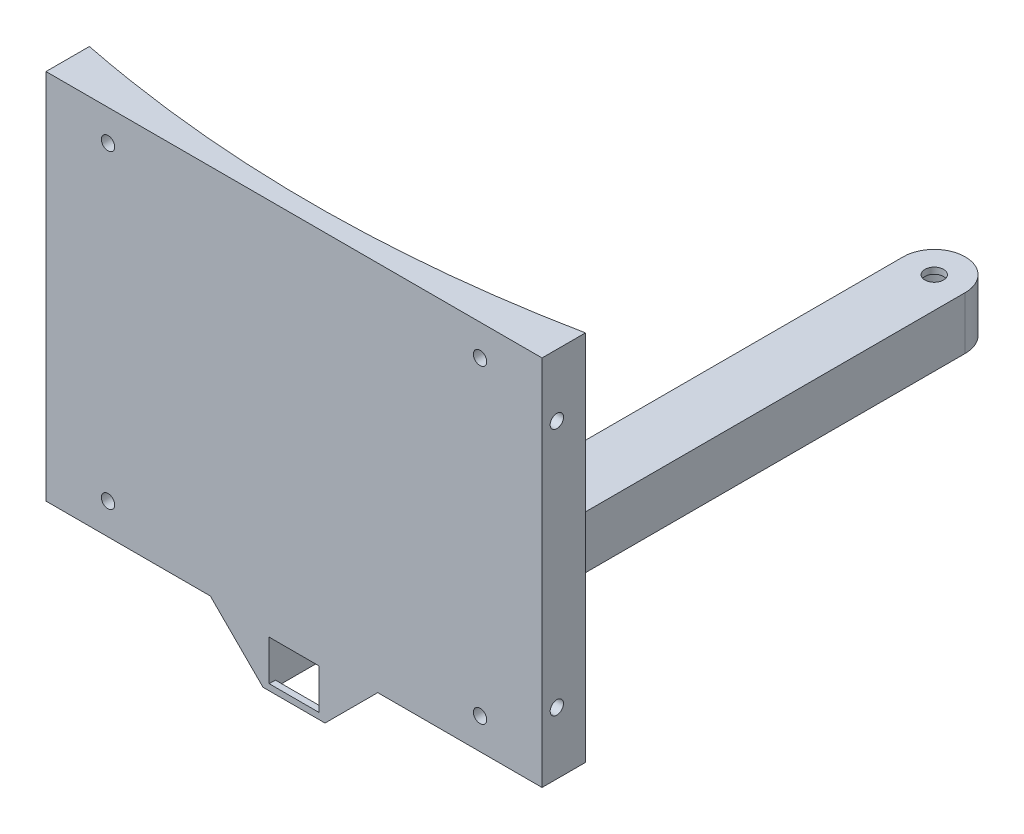
ISO-10303-21;
HEADER;
FILE_DESCRIPTION(('STEP AP214'),'2;1');
FILE_NAME('part.step','',(''),(''),'','','');
FILE_SCHEMA(('AUTOMOTIVE_DESIGN { 1 0 10303 214 1 1 1 1 }'));
ENDSEC;
DATA;
#1=APPLICATION_CONTEXT('core data for automotive mechanical design processes');
#2=APPLICATION_PROTOCOL_DEFINITION('international standard','automotive_design',2000,#1);
#3=PRODUCT_CONTEXT('',#1,'mechanical');
#4=PRODUCT('Part','Part','',(#3));
#5=PRODUCT_RELATED_PRODUCT_CATEGORY('part','',(#4));
#6=PRODUCT_DEFINITION_FORMATION('','',#4);
#7=PRODUCT_DEFINITION_CONTEXT('part definition',#1,'design');
#8=PRODUCT_DEFINITION('design','',#6,#7);
#9=PRODUCT_DEFINITION_SHAPE('','',#8);
#10=(LENGTH_UNIT() NAMED_UNIT(*) SI_UNIT(.MILLI.,.METRE.));
#11=(NAMED_UNIT(*) PLANE_ANGLE_UNIT() SI_UNIT($,.RADIAN.));
#12=(NAMED_UNIT(*) SI_UNIT($,.STERADIAN.) SOLID_ANGLE_UNIT());
#13=UNCERTAINTY_MEASURE_WITH_UNIT(LENGTH_MEASURE(1.E-05),#10,'distance_accuracy_value','');
#14=(GEOMETRIC_REPRESENTATION_CONTEXT(3) GLOBAL_UNCERTAINTY_ASSIGNED_CONTEXT((#13)) GLOBAL_UNIT_ASSIGNED_CONTEXT((#10,
#11,#12)) REPRESENTATION_CONTEXT('',''));
#15=CARTESIAN_POINT('',(0.,0.,0.));
#16=DIRECTION('',(0.,0.,1.));
#17=DIRECTION('',(1.,0.,0.));
#18=AXIS2_PLACEMENT_3D('',#15,#16,#17);
#19=CARTESIAN_POINT('',(0.,0.,200.499999999989));
#20=DIRECTION('',(0.,-1.,0.));
#21=DIRECTION('',(0.,0.,-1.));
#22=AXIS2_PLACEMENT_3D('',#19,#20,#21);
#23=PLANE('',#22);
#24=CARTESIAN_POINT('',(225.245130619814,0.,137.154537768553));
#25=CARTESIAN_POINT('',(222.90817603296,0.,138.469074723659));
#26=CARTESIAN_POINT('',(218.204067638298,0.,141.073902870023));
#27=CARTESIAN_POINT('',(208.827276173062,0.,146.100944940152));
#28=CARTESIAN_POINT('',(197.0951136339,0.,152.081763048426));
#29=CARTESIAN_POINT('',(183.020628450953,0.,158.761564513527));
#30=CARTESIAN_POINT('',(164.252323786063,0.,167.009400213228));
#31=CARTESIAN_POINT('',(140.791197461162,0.,176.082259845337));
#32=CARTESIAN_POINT('',(112.635650998168,0.,184.990896120193));
#33=CARTESIAN_POINT('',(84.4784352769108,0.,191.920233494286));
#34=CARTESIAN_POINT('',(46.9335816501035,0.,198.519950199365));
#35=CARTESIAN_POINT('',(-3.53883589099269E-13,0.,201.820033200405));
#36=CARTESIAN_POINT('',(-46.9335816501066,0.,198.519950199364));
#37=CARTESIAN_POINT('',(-84.4784352769144,0.,191.920233494286));
#38=CARTESIAN_POINT('',(-112.635650998168,0.,184.990896120192));
#39=CARTESIAN_POINT('',(-140.791197461168,0.,176.082259845335));
#40=CARTESIAN_POINT('',(-164.252323786066,0.,167.009400213228));
#41=CARTESIAN_POINT('',(-183.020628450954,0.,158.761564513527));
#42=CARTESIAN_POINT('',(-197.095113633908,0.,152.081763048424));
#43=CARTESIAN_POINT('',(-208.827276173067,0.,146.100944940152));
#44=CARTESIAN_POINT('',(-218.204067638301,0.,141.073902870022));
#45=CARTESIAN_POINT('',(-222.908176032963,0.,138.469074723657));
#46=CARTESIAN_POINT('',(-225.245130619819,0.,137.154537768551));
#47=B_SPLINE_CURVE_WITH_KNOTS('',3,(#24,#25,#26,#27,#28,#29,#30,#31,#32,#33,#34,#35,#36,#37,#38,
#39,#40,#41,#42,#43,#44,#45,#46),.UNSPECIFIED.,.F.,.F.,(4,1,1,1,1,1,1,1,1,1,1,1,1,1,1,1,1,1,1,1,
4),(0.496022524355826,0.496146820469706,0.496271116583587,0.496519708811347,0.496768301039108,
0.497016893266869,0.497514077722391,0.498011262177913,0.498508446633435,0.499005631088956,0.5,
0.500994368911044,0.501491553366565,0.501988737822087,0.502485922277609,0.502983106733131,
0.503231698960892,0.503480291188652,0.503728883416413,0.503853179530294,0.503977475644174),.UNSPECIFIED.);
#48=CARTESIAN_POINT('',(-26.9999999999983,0.,199.589880850301));
#49=VERTEX_POINT('',#48);
#50=CARTESIAN_POINT('',(-80.0000000000013,0.,192.509889922573));
#51=VERTEX_POINT('',#50);
#52=EDGE_CURVE('E254',#49,#51,#47,.T.);
#53=ORIENTED_EDGE('',*,*,#52,.F.);
#54=DIRECTION('',(0.,0.,1.));
#55=VECTOR('',#54,1.);
#56=CARTESIAN_POINT('',(-26.9999999999999,0.,200.499999999989));
#57=LINE('',#56,#55);
#58=CARTESIAN_POINT('',(-26.9999999999999,0.,206.499999999989));
#59=VERTEX_POINT('',#58);
#60=EDGE_CURVE('E353',#49,#59,#57,.T.);
#61=ORIENTED_EDGE('',*,*,#60,.T.);
#62=DIRECTION('',(1.,0.,0.));
#63=VECTOR('',#62,1.);
#64=CARTESIAN_POINT('',(-80.,0.,206.499999999989));
#65=LINE('',#64,#63);
#66=CARTESIAN_POINT('',(-80.,0.,206.499999999989));
#67=VERTEX_POINT('',#66);
#68=EDGE_CURVE('E345',#67,#59,#65,.T.);
#69=ORIENTED_EDGE('',*,*,#68,.F.);
#70=DIRECTION('',(0.,0.,1.));
#71=VECTOR('',#70,1.);
#72=CARTESIAN_POINT('',(-80.0000000000013,0.,192.509889922573));
#73=LINE('',#72,#71);
#74=EDGE_CURVE('E346',#51,#67,#73,.T.);
#75=ORIENTED_EDGE('',*,*,#74,.F.);
#76=EDGE_LOOP('',(#53,#61,#69,#75));
#77=FACE_BOUND('',#76,.T.);
#78=ADVANCED_FACE('F44',(#77),#23,.T.);
#79=CARTESIAN_POINT('',(225.245130619814,120.,137.154537768553));
#80=CARTESIAN_POINT('',(222.90817603296,120.,138.469074723659));
#81=CARTESIAN_POINT('',(218.204067638298,120.,141.073902870023));
#82=CARTESIAN_POINT('',(208.827276173062,120.,146.100944940152));
#83=CARTESIAN_POINT('',(197.0951136339,120.,152.081763048426));
#84=CARTESIAN_POINT('',(183.020628450953,120.,158.761564513527));
#85=CARTESIAN_POINT('',(164.252323786063,120.,167.009400213228));
#86=CARTESIAN_POINT('',(140.791197461162,120.,176.082259845337));
#87=CARTESIAN_POINT('',(112.635650998168,120.,184.990896120193));
#88=CARTESIAN_POINT('',(84.4784352769108,120.,191.920233494286));
#89=CARTESIAN_POINT('',(46.9335816501035,120.,198.519950199365));
#90=CARTESIAN_POINT('',(-3.53883589099269E-13,120.,201.820033200405));
#91=CARTESIAN_POINT('',(-46.9335816501066,120.,198.519950199364));
#92=CARTESIAN_POINT('',(-84.4784352769144,120.,191.920233494286));
#93=CARTESIAN_POINT('',(-112.635650998168,120.,184.990896120192));
#94=CARTESIAN_POINT('',(-140.791197461168,120.,176.082259845335));
#95=CARTESIAN_POINT('',(-164.252323786066,120.,167.009400213228));
#96=CARTESIAN_POINT('',(-183.020628450954,120.,158.761564513527));
#97=CARTESIAN_POINT('',(-197.095113633908,120.,152.081763048424));
#98=CARTESIAN_POINT('',(-208.827276173067,120.,146.100944940152));
#99=CARTESIAN_POINT('',(-218.204067638301,120.,141.073902870022));
#100=CARTESIAN_POINT('',(-222.908176032963,120.,138.469074723657));
#101=CARTESIAN_POINT('',(-225.245130619819,120.,137.154537768551));
#102=B_SPLINE_CURVE_WITH_KNOTS('',3,(#79,#80,#81,#82,#83,#84,#85,#86,#87,#88,#89,#90,#91,#92,
#93,#94,#95,#96,#97,#98,#99,#100,#101),.UNSPECIFIED.,.F.,.F.,(4,1,1,1,1,1,1,1,1,1,1,1,1,1,1,1,1,
1,1,1,4),(0.496022524355826,0.496146820469706,0.496271116583587,0.496519708811347,
0.496768301039108,0.497016893266869,0.497514077722391,0.498011262177913,0.498508446633435,
0.499005631088956,0.5,0.500994368911044,0.501491553366565,0.501988737822087,0.502485922277609,
0.502983106733131,0.503231698960892,0.503480291188652,0.503728883416413,0.503853179530294,
0.503977475644174),.UNSPECIFIED.);
#103=DIRECTION('',(0.,-1.,0.));
#104=VECTOR('',#103,1.);
#105=SURFACE_OF_LINEAR_EXTRUSION('',#102,#104);
#106=CARTESIAN_POINT('',(23.7702157531355,0.,199.794596875959));
#107=VERTEX_POINT('',#106);
#108=CARTESIAN_POINT('',(-23.7702157531355,0.,199.794596875959));
#109=VERTEX_POINT('',#108);
#110=EDGE_CURVE('E585',#107,#109,#47,.T.);
#111=ORIENTED_EDGE('',*,*,#110,.T.);
#112=DIRECTION('',(0.,-1.,0.));
#113=VECTOR('',#112,1.);
#114=CARTESIAN_POINT('',(-23.7702157531355,0.,199.794596875959));
#115=LINE('',#114,#113);
#116=CARTESIAN_POINT('',(-23.7702157531349,-3.22978424686177,199.794596875959));
#117=VERTEX_POINT('',#116);
#118=EDGE_CURVE('E372',#109,#117,#115,.T.);
#119=ORIENTED_EDGE('',*,*,#118,.T.);
#120=CARTESIAN_POINT('',(-10.,-17.0000000000001,200.375154287834));
#121=CARTESIAN_POINT('',(-12.8347207037561,-14.1652792962442,200.304344386998));
#122=CARTESIAN_POINT('',(-15.6687477223007,-11.3312522776996,200.203499983452));
#123=CARTESIAN_POINT('',(-21.3354143889668,-5.6645856110329,199.941742170941));
#124=CARTESIAN_POINT('',(-24.1680540370883,-2.83194596291082,199.780828761976));
#125=CARTESIAN_POINT('',(-26.9999999999983,0.,199.589880850301));
#126=B_SPLINE_CURVE_WITH_KNOTS('',3,(#120,#121,#122,#123,#124,#125),.UNSPECIFIED.,.F.,.F.,(4,2,
4),(0.,12.0275637972397,24.0551275944795),.UNSPECIFIED.);
#127=EDGE_CURVE('E289',#117,#49,#126,.T.);
#128=ORIENTED_EDGE('',*,*,#127,.T.);
#129=ORIENTED_EDGE('',*,*,#52,.T.);
#130=DIRECTION('',(0.,-1.,0.));
#131=VECTOR('',#130,1.);
#132=CARTESIAN_POINT('',(-80.0000000000013,120.,192.509889922573));
#133=LINE('',#132,#131);
#134=CARTESIAN_POINT('',(-80.0000000000013,120.,192.509889922573));
#135=VERTEX_POINT('',#134);
#136=EDGE_CURVE('E354',#135,#51,#133,.T.);
#137=ORIENTED_EDGE('',*,*,#136,.F.);
#138=CARTESIAN_POINT('',(80.,120.,192.509889922572));
#139=VERTEX_POINT('',#138);
#140=EDGE_CURVE('E255',#139,#135,#102,.T.);
#141=ORIENTED_EDGE('',*,*,#140,.F.);
#142=DIRECTION('',(0.,-1.,0.));
#143=VECTOR('',#142,1.);
#144=CARTESIAN_POINT('',(80.,120.,192.509889922572));
#145=LINE('',#144,#143);
#146=CARTESIAN_POINT('',(80.,0.,192.509889922572));
#147=VERTEX_POINT('',#146);
#148=EDGE_CURVE('E578',#139,#147,#145,.T.);
#149=ORIENTED_EDGE('',*,*,#148,.T.);
#150=CARTESIAN_POINT('',(27.0000000000014,0.,199.589880850301));
#151=VERTEX_POINT('',#150);
#152=EDGE_CURVE('E368',#147,#151,#47,.T.);
#153=ORIENTED_EDGE('',*,*,#152,.T.);
#154=CARTESIAN_POINT('',(26.9999999999999,0.,199.589880850301));
#155=CARTESIAN_POINT('',(24.1680540370894,-2.83194596291046,199.780828761976));
#156=CARTESIAN_POINT('',(21.3354143889675,-5.66458561103236,199.941742170942));
#157=CARTESIAN_POINT('',(15.668747722301,-11.3312522776991,200.203499983452));
#158=CARTESIAN_POINT('',(12.8347207037564,-14.1652792962438,200.304344386998));
#159=CARTESIAN_POINT('',(10.0000000000005,-17.0000000000001,200.375154287833));
#160=B_SPLINE_CURVE_WITH_KNOTS('',3,(#154,#155,#156,#157,#158,#159),.UNSPECIFIED.,.F.,.F.,(4,2,
4),(0.,12.0275637972401,24.0551275944803),.UNSPECIFIED.);
#161=CARTESIAN_POINT('',(23.7702157531352,-3.22978424686276,199.794596875959));
#162=VERTEX_POINT('',#161);
#163=EDGE_CURVE('E282',#151,#162,#160,.T.);
#164=ORIENTED_EDGE('',*,*,#163,.T.);
#165=DIRECTION('',(0.,-1.,0.));
#166=VECTOR('',#165,1.);
#167=CARTESIAN_POINT('',(23.7702157531355,-3.22978424686275,199.794596875959));
#168=LINE('',#167,#166);
#169=EDGE_CURVE('E365',#162,#107,#168,.F.);
#170=ORIENTED_EDGE('',*,*,#169,.T.);
#171=EDGE_LOOP('',(#111,#119,#128,#129,#137,#141,#149,#153,#164,#170));
#172=FACE_BOUND('',#171,.T.);
#173=ADVANCED_FACE('F268',(#172),#105,.F.);
#174=CARTESIAN_POINT('',(-80.0000000000013,120.,192.509889922573));
#175=DIRECTION('',(1.,0.,0.));
#176=DIRECTION('',(0.,0.,-1.));
#177=AXIS2_PLACEMENT_3D('',#174,#175,#176);
#178=PLANE('',#177);
#179=CARTESIAN_POINT('',(-80.,100.,201.728635759915));
#180=DIRECTION('',(1.,0.,0.));
#181=DIRECTION('',(0.,0.,-1.));
#182=AXIS2_PLACEMENT_3D('',#179,#180,#181);
#183=CIRCLE('',#182,2.15000000000001);
#184=CARTESIAN_POINT('',(-80.,100.,199.578635759915));
#185=VERTEX_POINT('',#184);
#186=EDGE_CURVE('E544',#185,#185,#183,.T.);
#187=ORIENTED_EDGE('',*,*,#186,.T.);
#188=EDGE_LOOP('',(#187));
#189=FACE_BOUND('',#188,.T.);
#190=CARTESIAN_POINT('',(-80.,20.,201.728635759916));
#191=DIRECTION('',(1.,0.,0.));
#192=DIRECTION('',(0.,0.,-1.));
#193=AXIS2_PLACEMENT_3D('',#190,#191,#192);
#194=CIRCLE('',#193,2.15000000000002);
#195=CARTESIAN_POINT('',(-80.,20.,199.578635759916));
#196=VERTEX_POINT('',#195);
#197=EDGE_CURVE('E537',#196,#196,#194,.T.);
#198=ORIENTED_EDGE('',*,*,#197,.T.);
#199=EDGE_LOOP('',(#198));
#200=FACE_BOUND('',#199,.T.);
#201=ORIENTED_EDGE('',*,*,#74,.T.);
#202=DIRECTION('',(0.,-1.,0.));
#203=VECTOR('',#202,1.);
#204=CARTESIAN_POINT('',(-80.,120.,206.499999999989));
#205=LINE('',#204,#203);
#206=CARTESIAN_POINT('',(-80.,120.,206.499999999989));
#207=VERTEX_POINT('',#206);
#208=EDGE_CURVE('E358',#207,#67,#205,.T.);
#209=ORIENTED_EDGE('',*,*,#208,.F.);
#210=DIRECTION('',(0.,0.,1.));
#211=VECTOR('',#210,1.);
#212=CARTESIAN_POINT('',(-80.0000000000013,120.,192.509889922573));
#213=LINE('',#212,#211);
#214=EDGE_CURVE('E261',#135,#207,#213,.T.);
#215=ORIENTED_EDGE('',*,*,#214,.F.);
#216=ORIENTED_EDGE('',*,*,#136,.T.);
#217=EDGE_LOOP('',(#201,#209,#215,#216));
#218=FACE_BOUND('',#217,.T.);
#219=ADVANCED_FACE('F273',(#189,#200,#218),#178,.F.);
#220=CARTESIAN_POINT('',(-80.,120.,206.499999999989));
#221=DIRECTION('',(0.,0.,-1.));
#222=DIRECTION('',(-1.,0.,0.));
#223=AXIS2_PLACEMENT_3D('',#220,#221,#222);
#224=PLANE('',#223);
#225=CARTESIAN_POINT('',(60.,10.,206.499999999989));
#226=DIRECTION('',(0.,0.,1.));
#227=DIRECTION('',(1.,0.,0.));
#228=AXIS2_PLACEMENT_3D('',#225,#226,#227);
#229=CIRCLE('',#228,2.15);
#230=CARTESIAN_POINT('',(62.15,10.,206.499999999989));
#231=VERTEX_POINT('',#230);
#232=EDGE_CURVE('E522',#231,#231,#229,.T.);
#233=ORIENTED_EDGE('',*,*,#232,.F.);
#234=EDGE_LOOP('',(#233));
#235=FACE_BOUND('',#234,.T.);
#236=CARTESIAN_POINT('',(-60.,110.,206.499999999989));
#237=DIRECTION('',(0.,0.,1.));
#238=DIRECTION('',(1.,0.,0.));
#239=AXIS2_PLACEMENT_3D('',#236,#237,#238);
#240=CIRCLE('',#239,2.15);
#241=CARTESIAN_POINT('',(-57.85,110.,206.499999999989));
#242=VERTEX_POINT('',#241);
#243=EDGE_CURVE('E529',#242,#242,#240,.T.);
#244=ORIENTED_EDGE('',*,*,#243,.F.);
#245=EDGE_LOOP('',(#244));
#246=FACE_BOUND('',#245,.T.);
#247=CARTESIAN_POINT('',(-60.,10.,206.499999999989));
#248=DIRECTION('',(0.,0.,1.));
#249=DIRECTION('',(1.,0.,0.));
#250=AXIS2_PLACEMENT_3D('',#247,#248,#249);
#251=CIRCLE('',#250,2.15);
#252=CARTESIAN_POINT('',(-57.85,10.,206.499999999989));
#253=VERTEX_POINT('',#252);
#254=EDGE_CURVE('E515',#253,#253,#251,.T.);
#255=ORIENTED_EDGE('',*,*,#254,.F.);
#256=EDGE_LOOP('',(#255));
#257=FACE_BOUND('',#256,.T.);
#258=CARTESIAN_POINT('',(60.,110.,206.499999999989));
#259=DIRECTION('',(0.,0.,1.));
#260=DIRECTION('',(1.,0.,0.));
#261=AXIS2_PLACEMENT_3D('',#258,#259,#260);
#262=CIRCLE('',#261,2.15);
#263=CARTESIAN_POINT('',(62.15,110.,206.499999999989));
#264=VERTEX_POINT('',#263);
#265=EDGE_CURVE('E525',#264,#264,#262,.T.);
#266=ORIENTED_EDGE('',*,*,#265,.F.);
#267=EDGE_LOOP('',(#266));
#268=FACE_BOUND('',#267,.T.);
#269=DIRECTION('',(-1.,0.,0.));
#270=VECTOR('',#269,1.);
#271=CARTESIAN_POINT('',(7.99999999999997,-2.,206.499999999989));
#272=LINE('',#271,#270);
#273=CARTESIAN_POINT('',(7.99999999999997,-2.,206.499999999989));
#274=VERTEX_POINT('',#273);
#275=CARTESIAN_POINT('',(-7.99999999999999,-2.,206.499999999989));
#276=VERTEX_POINT('',#275);
#277=EDGE_CURVE('E187',#274,#276,#272,.T.);
#278=ORIENTED_EDGE('',*,*,#277,.F.);
#279=DIRECTION('',(0.,1.,0.));
#280=VECTOR('',#279,1.);
#281=CARTESIAN_POINT('',(7.99999999999997,-15.,206.499999999989));
#282=LINE('',#281,#280);
#283=CARTESIAN_POINT('',(7.99999999999997,-15.,206.499999999989));
#284=VERTEX_POINT('',#283);
#285=EDGE_CURVE('E192',#284,#274,#282,.T.);
#286=ORIENTED_EDGE('',*,*,#285,.F.);
#287=DIRECTION('',(1.,0.,0.));
#288=VECTOR('',#287,1.);
#289=CARTESIAN_POINT('',(7.99999999999997,-15.,206.499999999989));
#290=LINE('',#289,#288);
#291=CARTESIAN_POINT('',(-7.99999999999999,-15.,206.499999999989));
#292=VERTEX_POINT('',#291);
#293=EDGE_CURVE('E197',#292,#284,#290,.T.);
#294=ORIENTED_EDGE('',*,*,#293,.F.);
#295=DIRECTION('',(0.,-1.,0.));
#296=VECTOR('',#295,1.);
#297=CARTESIAN_POINT('',(-7.99999999999999,-15.,206.499999999989));
#298=LINE('',#297,#296);
#299=EDGE_CURVE('E176',#276,#292,#298,.T.);
#300=ORIENTED_EDGE('',*,*,#299,.F.);
#301=EDGE_LOOP('',(#278,#286,#294,#300));
#302=FACE_BOUND('',#301,.T.);
#303=ORIENTED_EDGE('',*,*,#68,.T.);
#304=DIRECTION('',(0.707106781186544,-0.707106781186551,0.));
#305=VECTOR('',#304,1.);
#306=CARTESIAN_POINT('',(-113.5,86.5000000000006,206.499999999989));
#307=LINE('',#306,#305);
#308=CARTESIAN_POINT('',(-10.,-17.,206.499999999989));
#309=VERTEX_POINT('',#308);
#310=EDGE_CURVE('E295',#59,#309,#307,.T.);
#311=ORIENTED_EDGE('',*,*,#310,.T.);
#312=DIRECTION('',(-1.,0.,0.));
#313=VECTOR('',#312,1.);
#314=CARTESIAN_POINT('',(9.99999999999997,-17.,206.499999999989));
#315=LINE('',#314,#313);
#316=CARTESIAN_POINT('',(9.99999999999997,-17.,206.499999999989));
#317=VERTEX_POINT('',#316);
#318=EDGE_CURVE('E236',#317,#309,#315,.T.);
#319=ORIENTED_EDGE('',*,*,#318,.F.);
#320=DIRECTION('',(0.707106781186544,0.707106781186551,0.));
#321=VECTOR('',#320,1.);
#322=CARTESIAN_POINT('',(33.5000000000004,6.50000000000062,206.499999999989));
#323=LINE('',#322,#321);
#324=CARTESIAN_POINT('',(26.9999999999999,0.,206.499999999989));
#325=VERTEX_POINT('',#324);
#326=EDGE_CURVE('E350',#317,#325,#323,.T.);
#327=ORIENTED_EDGE('',*,*,#326,.T.);
#328=CARTESIAN_POINT('',(80.,0.,206.499999999989));
#329=VERTEX_POINT('',#328);
#330=EDGE_CURVE('E338',#325,#329,#65,.T.);
#331=ORIENTED_EDGE('',*,*,#330,.T.);
#332=DIRECTION('',(0.,-1.,0.));
#333=VECTOR('',#332,1.);
#334=CARTESIAN_POINT('',(80.,120.,206.499999999989));
#335=LINE('',#334,#333);
#336=CARTESIAN_POINT('',(80.,120.,206.499999999989));
#337=VERTEX_POINT('',#336);
#338=EDGE_CURVE('E580',#337,#329,#335,.T.);
#339=ORIENTED_EDGE('',*,*,#338,.F.);
#340=DIRECTION('',(1.,0.,0.));
#341=VECTOR('',#340,1.);
#342=CARTESIAN_POINT('',(-80.,120.,206.499999999989));
#343=LINE('',#342,#341);
#344=EDGE_CURVE('E595',#207,#337,#343,.T.);
#345=ORIENTED_EDGE('',*,*,#344,.F.);
#346=ORIENTED_EDGE('',*,*,#208,.T.);
#347=EDGE_LOOP('',(#303,#311,#319,#327,#331,#339,#345,#346));
#348=FACE_BOUND('',#347,.T.);
#349=ADVANCED_FACE('F194',(#235,#246,#257,#268,#302,#348),#224,.F.);
#350=CARTESIAN_POINT('',(80.,120.,192.509889922572));
#351=DIRECTION('',(-1.,0.,0.));
#352=DIRECTION('',(0.,0.,1.));
#353=AXIS2_PLACEMENT_3D('',#350,#351,#352);
#354=PLANE('',#353);
#355=CARTESIAN_POINT('',(80.,100.,201.728635759915));
#356=DIRECTION('',(1.,0.,0.));
#357=DIRECTION('',(0.,0.,-1.));
#358=AXIS2_PLACEMENT_3D('',#355,#356,#357);
#359=CIRCLE('',#358,2.15000000000001);
#360=CARTESIAN_POINT('',(80.,100.,199.578635759915));
#361=VERTEX_POINT('',#360);
#362=EDGE_CURVE('E555',#361,#361,#359,.T.);
#363=ORIENTED_EDGE('',*,*,#362,.F.);
#364=EDGE_LOOP('',(#363));
#365=FACE_BOUND('',#364,.T.);
#366=CARTESIAN_POINT('',(80.,20.,201.728635759916));
#367=DIRECTION('',(1.,0.,0.));
#368=DIRECTION('',(0.,0.,-1.));
#369=AXIS2_PLACEMENT_3D('',#366,#367,#368);
#370=CIRCLE('',#369,2.15000000000002);
#371=CARTESIAN_POINT('',(80.,20.,199.578635759916));
#372=VERTEX_POINT('',#371);
#373=EDGE_CURVE('E558',#372,#372,#370,.T.);
#374=ORIENTED_EDGE('',*,*,#373,.F.);
#375=EDGE_LOOP('',(#374));
#376=FACE_BOUND('',#375,.T.);
#377=DIRECTION('',(0.,0.,-1.));
#378=VECTOR('',#377,1.);
#379=CARTESIAN_POINT('',(80.,0.,192.509889922572));
#380=LINE('',#379,#378);
#381=EDGE_CURVE('E262',#329,#147,#380,.T.);
#382=ORIENTED_EDGE('',*,*,#381,.T.);
#383=ORIENTED_EDGE('',*,*,#148,.F.);
#384=DIRECTION('',(0.,0.,-1.));
#385=VECTOR('',#384,1.);
#386=CARTESIAN_POINT('',(80.,120.,192.509889922572));
#387=LINE('',#386,#385);
#388=EDGE_CURVE('E583',#337,#139,#387,.T.);
#389=ORIENTED_EDGE('',*,*,#388,.F.);
#390=ORIENTED_EDGE('',*,*,#338,.T.);
#391=EDGE_LOOP('',(#382,#383,#389,#390));
#392=FACE_BOUND('',#391,.T.);
#393=ADVANCED_FACE('F334',(#365,#376,#392),#354,.F.);
#394=CARTESIAN_POINT('',(0.,120.,200.499999999989));
#395=DIRECTION('',(0.,-1.,0.));
#396=DIRECTION('',(0.,0.,-1.));
#397=AXIS2_PLACEMENT_3D('',#394,#395,#396);
#398=PLANE('',#397);
#399=ORIENTED_EDGE('',*,*,#140,.T.);
#400=ORIENTED_EDGE('',*,*,#214,.T.);
#401=ORIENTED_EDGE('',*,*,#344,.T.);
#402=ORIENTED_EDGE('',*,*,#388,.T.);
#403=EDGE_LOOP('',(#399,#400,#401,#402));
#404=FACE_BOUND('',#403,.T.);
#405=ADVANCED_FACE('F325',(#404),#398,.F.);
#406=ORIENTED_EDGE('',*,*,#330,.F.);
#407=DIRECTION('',(0.,0.,-1.));
#408=VECTOR('',#407,1.);
#409=CARTESIAN_POINT('',(26.9999999999999,0.,200.499999999989));
#410=LINE('',#409,#408);
#411=EDGE_CURVE('E341',#325,#151,#410,.T.);
#412=ORIENTED_EDGE('',*,*,#411,.T.);
#413=ORIENTED_EDGE('',*,*,#152,.F.);
#414=ORIENTED_EDGE('',*,*,#381,.F.);
#415=EDGE_LOOP('',(#406,#412,#413,#414));
#416=FACE_BOUND('',#415,.T.);
#417=ADVANCED_FACE('F315',(#416),#23,.T.);
#418=CARTESIAN_POINT('',(0.,0.,0.));
#419=DIRECTION('',(0.,1.,0.));
#420=DIRECTION('',(0.,0.,1.));
#421=AXIS2_PLACEMENT_3D('',#418,#419,#420);
#422=PLANE('',#421);
#423=CARTESIAN_POINT('',(0.,0.,0.));
#424=DIRECTION('',(0.,1.,0.));
#425=DIRECTION('',(0.,0.,1.));
#426=AXIS2_PLACEMENT_3D('',#423,#424,#425);
#427=CIRCLE('',#426,3.);
#428=CARTESIAN_POINT('',(0.,0.,3.));
#429=VERTEX_POINT('',#428);
#430=EDGE_CURVE('E510',#429,#429,#427,.T.);
#431=ORIENTED_EDGE('',*,*,#430,.F.);
#432=EDGE_LOOP('',(#431));
#433=FACE_BOUND('',#432,.T.);
#434=ORIENTED_EDGE('',*,*,#110,.F.);
#435=CARTESIAN_POINT('',(22.9999999999987,0.,186.817433561366));
#436=DIRECTION('',(0.,1.,0.));
#437=DIRECTION('',(0.,0.,1.));
#438=AXIS2_PLACEMENT_3D('',#435,#436,#437);
#439=CIRCLE('',#438,13.);
#440=CARTESIAN_POINT('',(9.99999999999998,0.,186.817433561366));
#441=VERTEX_POINT('',#440);
#442=EDGE_CURVE('E12',#107,#441,#439,.F.);
#443=ORIENTED_EDGE('',*,*,#442,.T.);
#444=DIRECTION('',(0.,0.,1.));
#445=VECTOR('',#444,1.);
#446=CARTESIAN_POINT('',(10.,0.,0.));
#447=LINE('',#446,#445);
#448=CARTESIAN_POINT('',(10.,0.,0.));
#449=VERTEX_POINT('',#448);
#450=EDGE_CURVE('E243',#449,#441,#447,.T.);
#451=ORIENTED_EDGE('',*,*,#450,.F.);
#452=CARTESIAN_POINT('',(0.,0.,0.));
#453=DIRECTION('',(0.,-1.,0.));
#454=DIRECTION('',(0.,0.,1.));
#455=AXIS2_PLACEMENT_3D('',#452,#453,#454);
#456=CIRCLE('',#455,10.);
#457=CARTESIAN_POINT('',(-10.,0.,0.));
#458=VERTEX_POINT('',#457);
#459=EDGE_CURVE('E240',#458,#449,#456,.T.);
#460=ORIENTED_EDGE('',*,*,#459,.F.);
#461=DIRECTION('',(0.,0.,-1.));
#462=VECTOR('',#461,1.);
#463=CARTESIAN_POINT('',(-10.,0.,206.499999999989));
#464=LINE('',#463,#462);
#465=CARTESIAN_POINT('',(-10.,0.,186.817433561365));
#466=VERTEX_POINT('',#465);
#467=EDGE_CURVE('E246',#466,#458,#464,.T.);
#468=ORIENTED_EDGE('',*,*,#467,.F.);
#469=CARTESIAN_POINT('',(-22.9999999999985,0.,186.817433561365));
#470=DIRECTION('',(0.,1.,0.));
#471=DIRECTION('',(0.,0.,1.));
#472=AXIS2_PLACEMENT_3D('',#469,#470,#471);
#473=CIRCLE('',#472,13.);
#474=EDGE_CURVE('E380',#466,#109,#473,.F.);
#475=ORIENTED_EDGE('',*,*,#474,.T.);
#476=EDGE_LOOP('',(#434,#443,#451,#460,#468,#475));
#477=FACE_BOUND('',#476,.T.);
#478=ADVANCED_FACE('F324',(#433,#477),#422,.T.);
#479=CARTESIAN_POINT('',(0.,-2.,0.));
#480=DIRECTION('',(0.,1.,0.));
#481=DIRECTION('',(0.,0.,1.));
#482=AXIS2_PLACEMENT_3D('',#479,#480,#481);
#483=CYLINDRICAL_SURFACE('',#482,10.);
#484=ORIENTED_EDGE('',*,*,#459,.T.);
#485=DIRECTION('',(0.,1.,0.));
#486=VECTOR('',#485,1.);
#487=CARTESIAN_POINT('',(10.,-2.,0.));
#488=LINE('',#487,#486);
#489=CARTESIAN_POINT('',(10.,-17.,0.));
#490=VERTEX_POINT('',#489);
#491=EDGE_CURVE('E251',#490,#449,#488,.T.);
#492=ORIENTED_EDGE('',*,*,#491,.F.);
#493=CARTESIAN_POINT('',(0.,-17.,0.));
#494=DIRECTION('',(0.,-1.,0.));
#495=DIRECTION('',(0.,0.,-1.));
#496=AXIS2_PLACEMENT_3D('',#493,#494,#495);
#497=CIRCLE('',#496,10.);
#498=CARTESIAN_POINT('',(-10.,-17.,0.));
#499=VERTEX_POINT('',#498);
#500=EDGE_CURVE('E229',#499,#490,#497,.T.);
#501=ORIENTED_EDGE('',*,*,#500,.F.);
#502=DIRECTION('',(0.,1.,0.));
#503=VECTOR('',#502,1.);
#504=CARTESIAN_POINT('',(-10.,-2.,0.));
#505=LINE('',#504,#503);
#506=EDGE_CURVE('E248',#499,#458,#505,.T.);
#507=ORIENTED_EDGE('',*,*,#506,.T.);
#508=EDGE_LOOP('',(#484,#492,#501,#507));
#509=FACE_BOUND('',#508,.T.);
#510=ADVANCED_FACE('F330',(#509),#483,.T.);
#511=CARTESIAN_POINT('',(10.,-2.,0.));
#512=DIRECTION('',(-1.,0.,0.));
#513=DIRECTION('',(0.,0.,1.));
#514=AXIS2_PLACEMENT_3D('',#511,#512,#513);
#515=PLANE('',#514);
#516=ORIENTED_EDGE('',*,*,#450,.T.);
#517=DIRECTION('',(0.,1.,0.));
#518=VECTOR('',#517,1.);
#519=CARTESIAN_POINT('',(9.99999999999998,-17.,186.817433561366));
#520=LINE('',#519,#518);
#521=CARTESIAN_POINT('',(9.99999999999998,-17.,186.817433561366));
#522=VERTEX_POINT('',#521);
#523=EDGE_CURVE('E375',#441,#522,#520,.F.);
#524=ORIENTED_EDGE('',*,*,#523,.T.);
#525=DIRECTION('',(0.,0.,1.));
#526=VECTOR('',#525,1.);
#527=CARTESIAN_POINT('',(10.,-17.,0.));
#528=LINE('',#527,#526);
#529=EDGE_CURVE('E233',#490,#522,#528,.T.);
#530=ORIENTED_EDGE('',*,*,#529,.F.);
#531=ORIENTED_EDGE('',*,*,#491,.T.);
#532=EDGE_LOOP('',(#516,#524,#530,#531));
#533=FACE_BOUND('',#532,.T.);
#534=ADVANCED_FACE('F405',(#533),#515,.F.);
#535=CARTESIAN_POINT('',(-10.,-2.,206.499999999989));
#536=DIRECTION('',(1.,0.,0.));
#537=DIRECTION('',(0.,0.,-1.));
#538=AXIS2_PLACEMENT_3D('',#535,#536,#537);
#539=PLANE('',#538);
#540=DIRECTION('',(0.,0.,-1.));
#541=VECTOR('',#540,1.);
#542=CARTESIAN_POINT('',(-10.,-17.,206.499999999989));
#543=LINE('',#542,#541);
#544=CARTESIAN_POINT('',(-10.,-17.,186.817433561365));
#545=VERTEX_POINT('',#544);
#546=EDGE_CURVE('E238',#545,#499,#543,.T.);
#547=ORIENTED_EDGE('',*,*,#546,.F.);
#548=DIRECTION('',(0.,1.,0.));
#549=VECTOR('',#548,1.);
#550=CARTESIAN_POINT('',(-10.,0.,186.817433561365));
#551=LINE('',#550,#549);
#552=EDGE_CURVE('E373',#545,#466,#551,.T.);
#553=ORIENTED_EDGE('',*,*,#552,.T.);
#554=ORIENTED_EDGE('',*,*,#467,.T.);
#555=ORIENTED_EDGE('',*,*,#506,.F.);
#556=EDGE_LOOP('',(#547,#553,#554,#555));
#557=FACE_BOUND('',#556,.T.);
#558=ADVANCED_FACE('F398',(#557),#539,.F.);
#559=CARTESIAN_POINT('',(0.,-17.,0.));
#560=DIRECTION('',(0.,-1.,0.));
#561=DIRECTION('',(0.,0.,-1.));
#562=AXIS2_PLACEMENT_3D('',#559,#560,#561);
#563=PLANE('',#562);
#564=ORIENTED_EDGE('',*,*,#500,.T.);
#565=ORIENTED_EDGE('',*,*,#529,.T.);
#566=EDGE_CURVE('E232',#522,#317,#528,.T.);
#567=ORIENTED_EDGE('',*,*,#566,.T.);
#568=ORIENTED_EDGE('',*,*,#318,.T.);
#569=EDGE_CURVE('E59',#309,#545,#543,.T.);
#570=ORIENTED_EDGE('',*,*,#569,.T.);
#571=ORIENTED_EDGE('',*,*,#546,.T.);
#572=EDGE_LOOP('',(#564,#565,#567,#568,#570,#571));
#573=FACE_BOUND('',#572,.T.);
#574=DIRECTION('',(0.,0.,1.));
#575=VECTOR('',#574,1.);
#576=CARTESIAN_POINT('',(8.,-17.,0.));
#577=LINE('',#576,#575);
#578=CARTESIAN_POINT('',(8.,-17.,0.));
#579=VERTEX_POINT('',#578);
#580=CARTESIAN_POINT('',(8.,-17.,204.499999999989));
#581=VERTEX_POINT('',#580);
#582=EDGE_CURVE('E210',#579,#581,#577,.T.);
#583=ORIENTED_EDGE('',*,*,#582,.F.);
#584=CARTESIAN_POINT('',(0.,-17.,0.));
#585=DIRECTION('',(0.,-1.,0.));
#586=DIRECTION('',(0.,0.,-1.));
#587=AXIS2_PLACEMENT_3D('',#584,#585,#586);
#588=CIRCLE('',#587,8.);
#589=CARTESIAN_POINT('',(-8.,-17.,0.));
#590=VERTEX_POINT('',#589);
#591=EDGE_CURVE('E183',#590,#579,#588,.T.);
#592=ORIENTED_EDGE('',*,*,#591,.F.);
#593=DIRECTION('',(0.,0.,-1.));
#594=VECTOR('',#593,1.);
#595=CARTESIAN_POINT('',(-8.,-17.,204.499999999989));
#596=LINE('',#595,#594);
#597=CARTESIAN_POINT('',(-8.,-17.,204.499999999989));
#598=VERTEX_POINT('',#597);
#599=EDGE_CURVE('E215',#598,#590,#596,.T.);
#600=ORIENTED_EDGE('',*,*,#599,.F.);
#601=DIRECTION('',(-1.,0.,0.));
#602=VECTOR('',#601,1.);
#603=CARTESIAN_POINT('',(8.,-17.,204.499999999989));
#604=LINE('',#603,#602);
#605=EDGE_CURVE('E212',#581,#598,#604,.T.);
#606=ORIENTED_EDGE('',*,*,#605,.F.);
#607=EDGE_LOOP('',(#583,#592,#600,#606));
#608=FACE_BOUND('',#607,.T.);
#609=ADVANCED_FACE('F385',(#573,#608),#563,.T.);
#610=CARTESIAN_POINT('',(0.,-17.,0.));
#611=DIRECTION('',(0.,1.,0.));
#612=DIRECTION('',(0.,0.,1.));
#613=AXIS2_PLACEMENT_3D('',#610,#611,#612);
#614=CYLINDRICAL_SURFACE('',#613,8.);
#615=CARTESIAN_POINT('',(0.,-2.,0.));
#616=DIRECTION('',(0.,-1.,0.));
#617=DIRECTION('',(0.,0.,-1.));
#618=AXIS2_PLACEMENT_3D('',#615,#616,#617);
#619=CIRCLE('',#618,8.);
#620=CARTESIAN_POINT('',(-8.,-2.,0.));
#621=VERTEX_POINT('',#620);
#622=CARTESIAN_POINT('',(8.,-2.,0.));
#623=VERTEX_POINT('',#622);
#624=EDGE_CURVE('E208',#621,#623,#619,.T.);
#625=ORIENTED_EDGE('',*,*,#624,.F.);
#626=DIRECTION('',(0.,1.,0.));
#627=VECTOR('',#626,1.);
#628=CARTESIAN_POINT('',(-8.,-17.,0.));
#629=LINE('',#628,#627);
#630=EDGE_CURVE('E179',#590,#621,#629,.T.);
#631=ORIENTED_EDGE('',*,*,#630,.F.);
#632=ORIENTED_EDGE('',*,*,#591,.T.);
#633=DIRECTION('',(0.,1.,0.));
#634=VECTOR('',#633,1.);
#635=CARTESIAN_POINT('',(8.,-17.,0.));
#636=LINE('',#635,#634);
#637=EDGE_CURVE('E226',#579,#623,#636,.T.);
#638=ORIENTED_EDGE('',*,*,#637,.T.);
#639=EDGE_LOOP('',(#625,#631,#632,#638));
#640=FACE_BOUND('',#639,.T.);
#641=ADVANCED_FACE('F421',(#640),#614,.F.);
#642=CARTESIAN_POINT('',(8.,-17.,0.));
#643=DIRECTION('',(-1.,0.,0.));
#644=DIRECTION('',(0.,0.,1.));
#645=AXIS2_PLACEMENT_3D('',#642,#643,#644);
#646=PLANE('',#645);
#647=DIRECTION('',(0.,1.,0.));
#648=VECTOR('',#647,1.);
#649=CARTESIAN_POINT('',(8.,-17.,204.499999999989));
#650=LINE('',#649,#648);
#651=CARTESIAN_POINT('',(7.99999999999997,-15.,204.499999999989));
#652=VERTEX_POINT('',#651);
#653=EDGE_CURVE('E223',#581,#652,#650,.T.);
#654=ORIENTED_EDGE('',*,*,#653,.T.);
#655=DIRECTION('',(0.,0.,1.));
#656=VECTOR('',#655,1.);
#657=CARTESIAN_POINT('',(7.99999999999997,-15.,191.499999999989));
#658=LINE('',#657,#656);
#659=EDGE_CURVE('E203',#652,#284,#658,.T.);
#660=ORIENTED_EDGE('',*,*,#659,.T.);
#661=ORIENTED_EDGE('',*,*,#285,.T.);
#662=DIRECTION('',(0.,0.,1.));
#663=VECTOR('',#662,1.);
#664=CARTESIAN_POINT('',(8.,-2.,0.));
#665=LINE('',#664,#663);
#666=EDGE_CURVE('E184',#623,#274,#665,.T.);
#667=ORIENTED_EDGE('',*,*,#666,.F.);
#668=ORIENTED_EDGE('',*,*,#637,.F.);
#669=ORIENTED_EDGE('',*,*,#582,.T.);
#670=EDGE_LOOP('',(#654,#660,#661,#667,#668,#669));
#671=FACE_BOUND('',#670,.T.);
#672=ADVANCED_FACE('F424',(#671),#646,.T.);
#673=CARTESIAN_POINT('',(8.,-17.,204.499999999989));
#674=DIRECTION('',(0.,0.,-1.));
#675=DIRECTION('',(-1.,0.,0.));
#676=AXIS2_PLACEMENT_3D('',#673,#674,#675);
#677=PLANE('',#676);
#678=DIRECTION('',(-1.,0.,0.));
#679=VECTOR('',#678,1.);
#680=CARTESIAN_POINT('',(8.,-15.,204.499999999989));
#681=LINE('',#680,#679);
#682=CARTESIAN_POINT('',(-7.99999999999999,-15.,204.499999999989));
#683=VERTEX_POINT('',#682);
#684=EDGE_CURVE('E205',#652,#683,#681,.T.);
#685=ORIENTED_EDGE('',*,*,#684,.F.);
#686=ORIENTED_EDGE('',*,*,#653,.F.);
#687=ORIENTED_EDGE('',*,*,#605,.T.);
#688=DIRECTION('',(0.,1.,0.));
#689=VECTOR('',#688,1.);
#690=CARTESIAN_POINT('',(-8.,-17.,204.499999999989));
#691=LINE('',#690,#689);
#692=EDGE_CURVE('E220',#598,#683,#691,.T.);
#693=ORIENTED_EDGE('',*,*,#692,.T.);
#694=EDGE_LOOP('',(#685,#686,#687,#693));
#695=FACE_BOUND('',#694,.T.);
#696=ADVANCED_FACE('F428',(#695),#677,.T.);
#697=CARTESIAN_POINT('',(-8.,-17.,204.499999999989));
#698=DIRECTION('',(1.,0.,0.));
#699=DIRECTION('',(0.,0.,-1.));
#700=AXIS2_PLACEMENT_3D('',#697,#698,#699);
#701=PLANE('',#700);
#702=DIRECTION('',(0.,0.,-1.));
#703=VECTOR('',#702,1.);
#704=CARTESIAN_POINT('',(-8.,-2.,204.499999999989));
#705=LINE('',#704,#703);
#706=EDGE_CURVE('E171',#276,#621,#705,.T.);
#707=ORIENTED_EDGE('',*,*,#706,.F.);
#708=ORIENTED_EDGE('',*,*,#299,.T.);
#709=DIRECTION('',(0.,0.,1.));
#710=VECTOR('',#709,1.);
#711=CARTESIAN_POINT('',(-7.99999999999999,-15.,191.499999999989));
#712=LINE('',#711,#710);
#713=EDGE_CURVE('E199',#683,#292,#712,.T.);
#714=ORIENTED_EDGE('',*,*,#713,.F.);
#715=ORIENTED_EDGE('',*,*,#692,.F.);
#716=ORIENTED_EDGE('',*,*,#599,.T.);
#717=ORIENTED_EDGE('',*,*,#630,.T.);
#718=EDGE_LOOP('',(#707,#708,#714,#715,#716,#717));
#719=FACE_BOUND('',#718,.T.);
#720=ADVANCED_FACE('F173',(#719),#701,.T.);
#721=CARTESIAN_POINT('',(0.,-2.,0.));
#722=DIRECTION('',(0.,1.,0.));
#723=DIRECTION('',(0.,0.,1.));
#724=AXIS2_PLACEMENT_3D('',#721,#722,#723);
#725=PLANE('',#724);
#726=CARTESIAN_POINT('',(0.,-2.,0.));
#727=DIRECTION('',(0.,1.,0.));
#728=DIRECTION('',(0.,0.,1.));
#729=AXIS2_PLACEMENT_3D('',#726,#727,#728);
#730=CIRCLE('',#729,3.);
#731=CARTESIAN_POINT('',(0.,-2.,3.));
#732=VERTEX_POINT('',#731);
#733=EDGE_CURVE('E361',#732,#732,#730,.T.);
#734=ORIENTED_EDGE('',*,*,#733,.T.);
#735=EDGE_LOOP('',(#734));
#736=FACE_BOUND('',#735,.T.);
#737=ORIENTED_EDGE('',*,*,#706,.T.);
#738=ORIENTED_EDGE('',*,*,#624,.T.);
#739=ORIENTED_EDGE('',*,*,#666,.T.);
#740=ORIENTED_EDGE('',*,*,#277,.T.);
#741=EDGE_LOOP('',(#737,#738,#739,#740));
#742=FACE_BOUND('',#741,.T.);
#743=ADVANCED_FACE('F188',(#736,#742),#725,.F.);
#744=CARTESIAN_POINT('',(7.99999999999997,-15.,191.499999999989));
#745=DIRECTION('',(0.,-1.,0.));
#746=DIRECTION('',(0.,0.,-1.));
#747=AXIS2_PLACEMENT_3D('',#744,#745,#746);
#748=PLANE('',#747);
#749=ORIENTED_EDGE('',*,*,#684,.T.);
#750=ORIENTED_EDGE('',*,*,#713,.T.);
#751=ORIENTED_EDGE('',*,*,#293,.T.);
#752=ORIENTED_EDGE('',*,*,#659,.F.);
#753=EDGE_LOOP('',(#749,#750,#751,#752));
#754=FACE_BOUND('',#753,.T.);
#755=ADVANCED_FACE('F417',(#754),#748,.F.);
#756=CARTESIAN_POINT('',(70.,20.,201.728635759916));
#757=DIRECTION('',(1.,0.,0.));
#758=DIRECTION('',(0.,0.,-1.));
#759=AXIS2_PLACEMENT_3D('',#756,#757,#758);
#760=CYLINDRICAL_SURFACE('',#759,2.15000000000002);
#761=CARTESIAN_POINT('',(70.,20.,201.728635759916));
#762=DIRECTION('',(1.,0.,0.));
#763=DIRECTION('',(0.,0.,-1.));
#764=AXIS2_PLACEMENT_3D('',#761,#762,#763);
#765=CIRCLE('',#764,2.15000000000002);
#766=CARTESIAN_POINT('',(70.,20.,199.578635759916));
#767=VERTEX_POINT('',#766);
#768=EDGE_CURVE('E543',#767,#767,#765,.T.);
#769=ORIENTED_EDGE('',*,*,#768,.F.);
#770=EDGE_LOOP('',(#769));
#771=FACE_BOUND('',#770,.T.);
#772=ORIENTED_EDGE('',*,*,#373,.T.);
#773=EDGE_LOOP('',(#772));
#774=FACE_BOUND('',#773,.T.);
#775=ADVANCED_FACE('F437',(#771,#774),#760,.F.);
#776=CARTESIAN_POINT('',(70.,20.,201.728635759916));
#777=DIRECTION('',(1.,0.,0.));
#778=DIRECTION('',(0.,0.,-1.));
#779=AXIS2_PLACEMENT_3D('',#776,#777,#778);
#780=PLANE('',#779);
#781=ORIENTED_EDGE('',*,*,#768,.T.);
#782=EDGE_LOOP('',(#781));
#783=FACE_BOUND('',#782,.T.);
#784=ADVANCED_FACE('F439',(#783),#780,.T.);
#785=CARTESIAN_POINT('',(70.,100.,201.728635759915));
#786=DIRECTION('',(1.,0.,0.));
#787=DIRECTION('',(0.,0.,-1.));
#788=AXIS2_PLACEMENT_3D('',#785,#786,#787);
#789=CYLINDRICAL_SURFACE('',#788,2.15000000000001);
#790=CARTESIAN_POINT('',(70.,100.,201.728635759915));
#791=DIRECTION('',(1.,0.,0.));
#792=DIRECTION('',(0.,0.,-1.));
#793=AXIS2_PLACEMENT_3D('',#790,#791,#792);
#794=CIRCLE('',#793,2.15000000000001);
#795=CARTESIAN_POINT('',(70.,100.,199.578635759915));
#796=VERTEX_POINT('',#795);
#797=EDGE_CURVE('E552',#796,#796,#794,.T.);
#798=ORIENTED_EDGE('',*,*,#797,.F.);
#799=EDGE_LOOP('',(#798));
#800=FACE_BOUND('',#799,.T.);
#801=ORIENTED_EDGE('',*,*,#362,.T.);
#802=EDGE_LOOP('',(#801));
#803=FACE_BOUND('',#802,.T.);
#804=ADVANCED_FACE('F442',(#800,#803),#789,.F.);
#805=CARTESIAN_POINT('',(70.,100.,201.728635759915));
#806=DIRECTION('',(1.,0.,0.));
#807=DIRECTION('',(0.,0.,-1.));
#808=AXIS2_PLACEMENT_3D('',#805,#806,#807);
#809=PLANE('',#808);
#810=ORIENTED_EDGE('',*,*,#797,.T.);
#811=EDGE_LOOP('',(#810));
#812=FACE_BOUND('',#811,.T.);
#813=ADVANCED_FACE('F449',(#812),#809,.T.);
#814=CARTESIAN_POINT('',(-70.,20.,201.728635759916));
#815=DIRECTION('',(-1.,0.,0.));
#816=DIRECTION('',(0.,0.,1.));
#817=AXIS2_PLACEMENT_3D('',#814,#815,#816);
#818=CYLINDRICAL_SURFACE('',#817,2.15000000000002);
#819=CARTESIAN_POINT('',(-70.,20.,201.728635759916));
#820=DIRECTION('',(1.,0.,0.));
#821=DIRECTION('',(0.,0.,-1.));
#822=AXIS2_PLACEMENT_3D('',#819,#820,#821);
#823=CIRCLE('',#822,2.15000000000002);
#824=CARTESIAN_POINT('',(-70.,20.,199.578635759916));
#825=VERTEX_POINT('',#824);
#826=EDGE_CURVE('E547',#825,#825,#823,.T.);
#827=ORIENTED_EDGE('',*,*,#826,.T.);
#828=EDGE_LOOP('',(#827));
#829=FACE_BOUND('',#828,.T.);
#830=ORIENTED_EDGE('',*,*,#197,.F.);
#831=EDGE_LOOP('',(#830));
#832=FACE_BOUND('',#831,.T.);
#833=ADVANCED_FACE('F453',(#829,#832),#818,.F.);
#834=CARTESIAN_POINT('',(-70.,20.,201.728635759916));
#835=DIRECTION('',(-1.,0.,0.));
#836=DIRECTION('',(0.,0.,-1.));
#837=AXIS2_PLACEMENT_3D('',#834,#835,#836);
#838=PLANE('',#837);
#839=ORIENTED_EDGE('',*,*,#826,.F.);
#840=EDGE_LOOP('',(#839));
#841=FACE_BOUND('',#840,.T.);
#842=ADVANCED_FACE('F457',(#841),#838,.T.);
#843=CARTESIAN_POINT('',(-70.,100.,201.728635759915));
#844=DIRECTION('',(-1.,0.,0.));
#845=DIRECTION('',(0.,0.,1.));
#846=AXIS2_PLACEMENT_3D('',#843,#844,#845);
#847=CYLINDRICAL_SURFACE('',#846,2.15000000000001);
#848=CARTESIAN_POINT('',(-70.,100.,201.728635759915));
#849=DIRECTION('',(1.,0.,0.));
#850=DIRECTION('',(0.,0.,-1.));
#851=AXIS2_PLACEMENT_3D('',#848,#849,#850);
#852=CIRCLE('',#851,2.15000000000001);
#853=CARTESIAN_POINT('',(-70.,100.,199.578635759915));
#854=VERTEX_POINT('',#853);
#855=EDGE_CURVE('E540',#854,#854,#852,.T.);
#856=ORIENTED_EDGE('',*,*,#855,.T.);
#857=EDGE_LOOP('',(#856));
#858=FACE_BOUND('',#857,.T.);
#859=ORIENTED_EDGE('',*,*,#186,.F.);
#860=EDGE_LOOP('',(#859));
#861=FACE_BOUND('',#860,.T.);
#862=ADVANCED_FACE('F461',(#858,#861),#847,.F.);
#863=CARTESIAN_POINT('',(-70.,100.,201.728635759915));
#864=DIRECTION('',(-1.,0.,0.));
#865=DIRECTION('',(0.,0.,-1.));
#866=AXIS2_PLACEMENT_3D('',#863,#864,#865);
#867=PLANE('',#866);
#868=ORIENTED_EDGE('',*,*,#855,.F.);
#869=EDGE_LOOP('',(#868));
#870=FACE_BOUND('',#869,.T.);
#871=ADVANCED_FACE('F465',(#870),#867,.T.);
#872=CARTESIAN_POINT('',(60.,110.,199.499999999989));
#873=DIRECTION('',(0.,0.,1.));
#874=DIRECTION('',(1.,0.,0.));
#875=AXIS2_PLACEMENT_3D('',#872,#873,#874);
#876=CYLINDRICAL_SURFACE('',#875,2.15);
#877=CARTESIAN_POINT('',(60.,110.,199.499999999989));
#878=DIRECTION('',(0.,0.,1.));
#879=DIRECTION('',(1.,0.,0.));
#880=AXIS2_PLACEMENT_3D('',#877,#878,#879);
#881=CIRCLE('',#880,2.15);
#882=CARTESIAN_POINT('',(62.15,110.,199.499999999989));
#883=VERTEX_POINT('',#882);
#884=EDGE_CURVE('E534',#883,#883,#881,.T.);
#885=ORIENTED_EDGE('',*,*,#884,.F.);
#886=EDGE_LOOP('',(#885));
#887=FACE_BOUND('',#886,.T.);
#888=ORIENTED_EDGE('',*,*,#265,.T.);
#889=EDGE_LOOP('',(#888));
#890=FACE_BOUND('',#889,.T.);
#891=ADVANCED_FACE('F469',(#887,#890),#876,.F.);
#892=CARTESIAN_POINT('',(60.,110.,199.499999999989));
#893=DIRECTION('',(0.,0.,1.));
#894=DIRECTION('',(1.,0.,0.));
#895=AXIS2_PLACEMENT_3D('',#892,#893,#894);
#896=PLANE('',#895);
#897=ORIENTED_EDGE('',*,*,#884,.T.);
#898=EDGE_LOOP('',(#897));
#899=FACE_BOUND('',#898,.T.);
#900=ADVANCED_FACE('F473',(#899),#896,.T.);
#901=CARTESIAN_POINT('',(-60.,10.,199.499999999989));
#902=DIRECTION('',(0.,0.,1.));
#903=DIRECTION('',(1.,0.,0.));
#904=AXIS2_PLACEMENT_3D('',#901,#902,#903);
#905=CYLINDRICAL_SURFACE('',#904,2.15);
#906=CARTESIAN_POINT('',(-60.,10.,199.499999999989));
#907=DIRECTION('',(0.,0.,1.));
#908=DIRECTION('',(1.,0.,0.));
#909=AXIS2_PLACEMENT_3D('',#906,#907,#908);
#910=CIRCLE('',#909,2.15);
#911=CARTESIAN_POINT('',(-57.85,10.,199.499999999989));
#912=VERTEX_POINT('',#911);
#913=EDGE_CURVE('E513',#912,#912,#910,.T.);
#914=ORIENTED_EDGE('',*,*,#913,.F.);
#915=EDGE_LOOP('',(#914));
#916=FACE_BOUND('',#915,.T.);
#917=ORIENTED_EDGE('',*,*,#254,.T.);
#918=EDGE_LOOP('',(#917));
#919=FACE_BOUND('',#918,.T.);
#920=ADVANCED_FACE('F477',(#916,#919),#905,.F.);
#921=CARTESIAN_POINT('',(-60.,10.,199.499999999989));
#922=DIRECTION('',(0.,0.,1.));
#923=DIRECTION('',(1.,0.,0.));
#924=AXIS2_PLACEMENT_3D('',#921,#922,#923);
#925=PLANE('',#924);
#926=ORIENTED_EDGE('',*,*,#913,.T.);
#927=EDGE_LOOP('',(#926));
#928=FACE_BOUND('',#927,.T.);
#929=ADVANCED_FACE('F487',(#928),#925,.T.);
#930=CARTESIAN_POINT('',(-60.,110.,199.499999999989));
#931=DIRECTION('',(0.,0.,1.));
#932=DIRECTION('',(1.,0.,0.));
#933=AXIS2_PLACEMENT_3D('',#930,#931,#932);
#934=CYLINDRICAL_SURFACE('',#933,2.15);
#935=CARTESIAN_POINT('',(-60.,110.,199.499999999989));
#936=DIRECTION('',(0.,0.,1.));
#937=DIRECTION('',(1.,0.,0.));
#938=AXIS2_PLACEMENT_3D('',#935,#936,#937);
#939=CIRCLE('',#938,2.15);
#940=CARTESIAN_POINT('',(-57.85,110.,199.499999999989));
#941=VERTEX_POINT('',#940);
#942=EDGE_CURVE('E520',#941,#941,#939,.T.);
#943=ORIENTED_EDGE('',*,*,#942,.F.);
#944=EDGE_LOOP('',(#943));
#945=FACE_BOUND('',#944,.T.);
#946=ORIENTED_EDGE('',*,*,#243,.T.);
#947=EDGE_LOOP('',(#946));
#948=FACE_BOUND('',#947,.T.);
#949=ADVANCED_FACE('F483',(#945,#948),#934,.F.);
#950=CARTESIAN_POINT('',(-60.,110.,199.499999999989));
#951=DIRECTION('',(0.,0.,1.));
#952=DIRECTION('',(1.,0.,0.));
#953=AXIS2_PLACEMENT_3D('',#950,#951,#952);
#954=PLANE('',#953);
#955=ORIENTED_EDGE('',*,*,#942,.T.);
#956=EDGE_LOOP('',(#955));
#957=FACE_BOUND('',#956,.T.);
#958=ADVANCED_FACE('F479',(#957),#954,.T.);
#959=CARTESIAN_POINT('',(60.,10.,199.499999999989));
#960=DIRECTION('',(0.,0.,1.));
#961=DIRECTION('',(1.,0.,0.));
#962=AXIS2_PLACEMENT_3D('',#959,#960,#961);
#963=CYLINDRICAL_SURFACE('',#962,2.15);
#964=CARTESIAN_POINT('',(60.,10.,199.499999999989));
#965=DIRECTION('',(0.,0.,1.));
#966=DIRECTION('',(1.,0.,0.));
#967=AXIS2_PLACEMENT_3D('',#964,#965,#966);
#968=CIRCLE('',#967,2.15);
#969=CARTESIAN_POINT('',(62.15,10.,199.499999999989));
#970=VERTEX_POINT('',#969);
#971=EDGE_CURVE('E526',#970,#970,#968,.T.);
#972=ORIENTED_EDGE('',*,*,#971,.F.);
#973=EDGE_LOOP('',(#972));
#974=FACE_BOUND('',#973,.T.);
#975=ORIENTED_EDGE('',*,*,#232,.T.);
#976=EDGE_LOOP('',(#975));
#977=FACE_BOUND('',#976,.T.);
#978=ADVANCED_FACE('F482',(#974,#977),#963,.F.);
#979=CARTESIAN_POINT('',(60.,10.,199.499999999989));
#980=DIRECTION('',(0.,0.,1.));
#981=DIRECTION('',(1.,0.,0.));
#982=AXIS2_PLACEMENT_3D('',#979,#980,#981);
#983=PLANE('',#982);
#984=ORIENTED_EDGE('',*,*,#971,.T.);
#985=EDGE_LOOP('',(#984));
#986=FACE_BOUND('',#985,.T.);
#987=ADVANCED_FACE('F489',(#986),#983,.T.);
#988=CARTESIAN_POINT('',(0.,-7.,0.));
#989=DIRECTION('',(0.,1.,0.));
#990=DIRECTION('',(0.,0.,1.));
#991=AXIS2_PLACEMENT_3D('',#988,#989,#990);
#992=CYLINDRICAL_SURFACE('',#991,3.);
#993=ORIENTED_EDGE('',*,*,#430,.T.);
#994=EDGE_LOOP('',(#993));
#995=FACE_BOUND('',#994,.T.);
#996=ORIENTED_EDGE('',*,*,#733,.F.);
#997=EDGE_LOOP('',(#996));
#998=FACE_BOUND('',#997,.T.);
#999=ADVANCED_FACE('F492',(#995,#998),#992,.F.);
#1000=CARTESIAN_POINT('',(10.,-17.0000000000001,0.));
#1001=DIRECTION('',(-0.707106781186551,0.707106781186544,0.));
#1002=DIRECTION('',(0.,0.,1.));
#1003=AXIS2_PLACEMENT_3D('',#1000,#1001,#1002);
#1004=PLANE('',#1003);
#1005=ORIENTED_EDGE('',*,*,#163,.F.);
#1006=ORIENTED_EDGE('',*,*,#411,.F.);
#1007=ORIENTED_EDGE('',*,*,#326,.F.);
#1008=ORIENTED_EDGE('',*,*,#566,.F.);
#1009=CARTESIAN_POINT('',(22.9999999999987,-4.00000000000122,186.817433561366));
#1010=DIRECTION('',(-0.707106781186551,0.707106781186544,0.));
#1011=DIRECTION('',(-0.707106781186544,-0.707106781186551,0.));
#1012=AXIS2_PLACEMENT_3D('',#1009,#1010,#1011);
#1013=ELLIPSE('',#1012,18.3847763108503,13.);
#1014=EDGE_CURVE('E53',#522,#162,#1013,.T.);
#1015=ORIENTED_EDGE('',*,*,#1014,.T.);
#1016=EDGE_LOOP('',(#1005,#1006,#1007,#1008,#1015));
#1017=FACE_BOUND('',#1016,.T.);
#1018=ADVANCED_FACE('F277',(#1017),#1004,.F.);
#1019=CARTESIAN_POINT('',(-10.,-17.0000000000001,206.499999999989));
#1020=DIRECTION('',(0.707106781186551,0.707106781186544,0.));
#1021=DIRECTION('',(0.,0.,-1.));
#1022=AXIS2_PLACEMENT_3D('',#1019,#1020,#1021);
#1023=PLANE('',#1022);
#1024=ORIENTED_EDGE('',*,*,#310,.F.);
#1025=ORIENTED_EDGE('',*,*,#60,.F.);
#1026=ORIENTED_EDGE('',*,*,#127,.F.);
#1027=CARTESIAN_POINT('',(-22.9999999999985,-4.00000000000143,186.817433561365));
#1028=DIRECTION('',(0.707106781186551,0.707106781186544,0.));
#1029=DIRECTION('',(0.707106781186544,-0.707106781186551,0.));
#1030=AXIS2_PLACEMENT_3D('',#1027,#1028,#1029);
#1031=ELLIPSE('',#1030,18.3847763108503,13.);
#1032=EDGE_CURVE('E383',#117,#545,#1031,.T.);
#1033=ORIENTED_EDGE('',*,*,#1032,.T.);
#1034=ORIENTED_EDGE('',*,*,#569,.F.);
#1035=EDGE_LOOP('',(#1024,#1025,#1026,#1033,#1034));
#1036=FACE_BOUND('',#1035,.T.);
#1037=ADVANCED_FACE('F298',(#1036),#1023,.F.);
#1038=CARTESIAN_POINT('',(-22.9999999999985,-8.50000000000001,186.817433561365));
#1039=DIRECTION('',(0.,-1.,0.));
#1040=DIRECTION('',(0.,0.,-1.));
#1041=AXIS2_PLACEMENT_3D('',#1038,#1039,#1040);
#1042=CYLINDRICAL_SURFACE('',#1041,13.);
#1043=ORIENTED_EDGE('',*,*,#1032,.F.);
#1044=ORIENTED_EDGE('',*,*,#118,.F.);
#1045=ORIENTED_EDGE('',*,*,#474,.F.);
#1046=ORIENTED_EDGE('',*,*,#552,.F.);
#1047=EDGE_LOOP('',(#1043,#1044,#1045,#1046));
#1048=FACE_BOUND('',#1047,.T.);
#1049=ADVANCED_FACE('F303',(#1048),#1042,.F.);
#1050=CARTESIAN_POINT('',(22.9999999999987,-8.50000000000001,186.817433561366));
#1051=DIRECTION('',(0.,-1.,0.));
#1052=DIRECTION('',(0.,0.,-1.));
#1053=AXIS2_PLACEMENT_3D('',#1050,#1051,#1052);
#1054=CYLINDRICAL_SURFACE('',#1053,13.);
#1055=ORIENTED_EDGE('',*,*,#442,.F.);
#1056=ORIENTED_EDGE('',*,*,#169,.F.);
#1057=ORIENTED_EDGE('',*,*,#1014,.F.);
#1058=ORIENTED_EDGE('',*,*,#523,.F.);
#1059=EDGE_LOOP('',(#1055,#1056,#1057,#1058));
#1060=FACE_BOUND('',#1059,.T.);
#1061=ADVANCED_FACE('F46',(#1060),#1054,.F.);
#1062=CLOSED_SHELL('',(#78,#173,#219,#349,#393,#405,#417,#478,#510,#534,#558,#609,#641,#672,
#696,#720,#743,#755,#775,#784,#804,#813,#833,#842,#862,#871,#891,#900,#920,#929,#949,#958,#978,
#987,#999,#1018,#1037,#1049,#1061));
#1063=MANIFOLD_SOLID_BREP('B2',#1062);
#1064=ADVANCED_BREP_SHAPE_REPRESENTATION('',(#18,#1063),#14);
#1065=SHAPE_DEFINITION_REPRESENTATION(#9,#1064);
ENDSEC;
END-ISO-10303-21;
